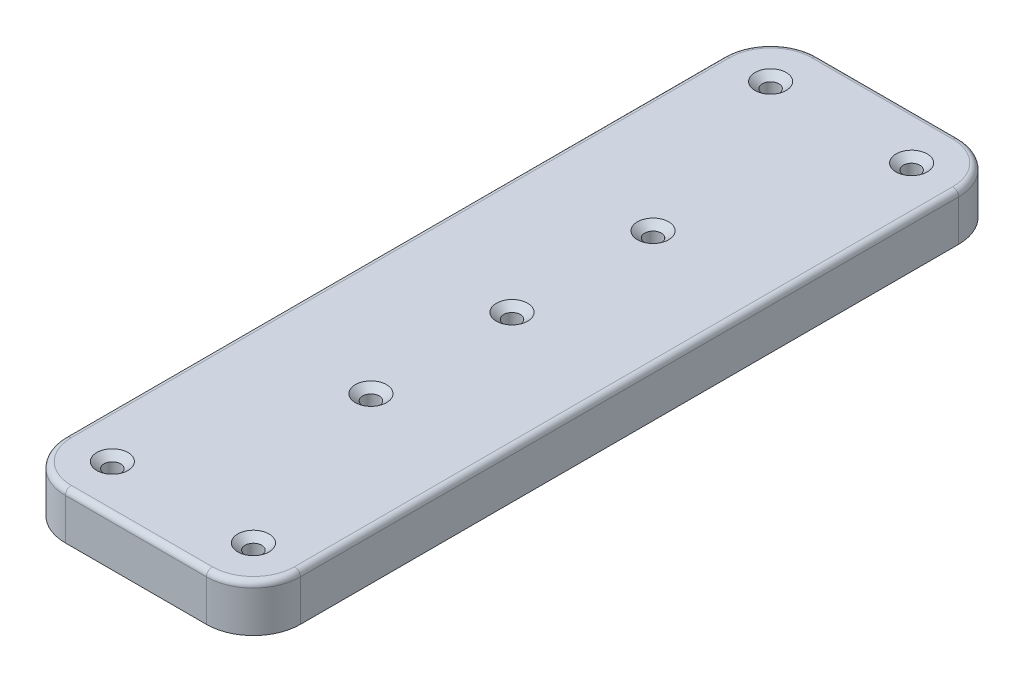
ISO-10303-21;
HEADER;
FILE_DESCRIPTION(('STEP AP214'),'2;1');
FILE_NAME('part.step','',(''),(''),'','','');
FILE_SCHEMA(('AUTOMOTIVE_DESIGN { 1 0 10303 214 1 1 1 1 }'));
ENDSEC;
DATA;
#1=APPLICATION_CONTEXT('core data for automotive mechanical design processes');
#2=APPLICATION_PROTOCOL_DEFINITION('international standard','automotive_design',2000,#1);
#3=PRODUCT_CONTEXT('',#1,'mechanical');
#4=PRODUCT('Part','Part','',(#3));
#5=PRODUCT_RELATED_PRODUCT_CATEGORY('part','',(#4));
#6=PRODUCT_DEFINITION_FORMATION('','',#4);
#7=PRODUCT_DEFINITION_CONTEXT('part definition',#1,'design');
#8=PRODUCT_DEFINITION('design','',#6,#7);
#9=PRODUCT_DEFINITION_SHAPE('','',#8);
#10=(LENGTH_UNIT() NAMED_UNIT(*) SI_UNIT(.MILLI.,.METRE.));
#11=(NAMED_UNIT(*) PLANE_ANGLE_UNIT() SI_UNIT($,.RADIAN.));
#12=(NAMED_UNIT(*) SI_UNIT($,.STERADIAN.) SOLID_ANGLE_UNIT());
#13=UNCERTAINTY_MEASURE_WITH_UNIT(LENGTH_MEASURE(1.E-05),#10,'distance_accuracy_value','');
#14=(GEOMETRIC_REPRESENTATION_CONTEXT(3) GLOBAL_UNCERTAINTY_ASSIGNED_CONTEXT((#13)) GLOBAL_UNIT_ASSIGNED_CONTEXT((#10,
#11,#12)) REPRESENTATION_CONTEXT('',''));
#15=CARTESIAN_POINT('',(0.,0.,0.));
#16=DIRECTION('',(0.,0.,1.));
#17=DIRECTION('',(1.,0.,0.));
#18=AXIS2_PLACEMENT_3D('',#15,#16,#17);
#19=CARTESIAN_POINT('',(-31.75,6.35,101.6));
#20=DIRECTION('',(0.,-1.,0.));
#21=DIRECTION('',(0.,0.,-1.));
#22=AXIS2_PLACEMENT_3D('',#19,#20,#21);
#23=PLANE('',#22);
#24=DIRECTION('',(0.,0.,-1.));
#25=VECTOR('',#24,1.);
#26=CARTESIAN_POINT('',(-30.1625,6.35,101.6));
#27=LINE('',#26,#25);
#28=CARTESIAN_POINT('',(-30.1625,6.35,-88.9));
#29=VERTEX_POINT('',#28);
#30=CARTESIAN_POINT('',(-30.1625,6.35,88.9));
#31=VERTEX_POINT('',#30);
#32=EDGE_CURVE('E169',#29,#31,#27,.F.);
#33=ORIENTED_EDGE('',*,*,#32,.T.);
#34=CARTESIAN_POINT('',(-19.05,6.35,88.9));
#35=DIRECTION('',(0.,-1.,0.));
#36=DIRECTION('',(0.,0.,-1.));
#37=AXIS2_PLACEMENT_3D('',#34,#35,#36);
#38=CIRCLE('',#37,11.1125);
#39=CARTESIAN_POINT('',(-19.05,6.35,100.0125));
#40=VERTEX_POINT('',#39);
#41=EDGE_CURVE('E183',#31,#40,#38,.F.);
#42=ORIENTED_EDGE('',*,*,#41,.T.);
#43=DIRECTION('',(-1.,0.,0.));
#44=VECTOR('',#43,1.);
#45=CARTESIAN_POINT('',(-31.75,6.35,100.0125));
#46=LINE('',#45,#44);
#47=CARTESIAN_POINT('',(19.05,6.35,100.0125));
#48=VERTEX_POINT('',#47);
#49=EDGE_CURVE('E181',#40,#48,#46,.F.);
#50=ORIENTED_EDGE('',*,*,#49,.T.);
#51=CARTESIAN_POINT('',(19.05,6.35,88.9));
#52=DIRECTION('',(0.,-1.,0.));
#53=DIRECTION('',(0.,0.,-1.));
#54=AXIS2_PLACEMENT_3D('',#51,#52,#53);
#55=CIRCLE('',#54,11.1125);
#56=CARTESIAN_POINT('',(30.1625,6.35,88.9));
#57=VERTEX_POINT('',#56);
#58=EDGE_CURVE('E179',#48,#57,#55,.F.);
#59=ORIENTED_EDGE('',*,*,#58,.T.);
#60=DIRECTION('',(0.,0.,-1.));
#61=VECTOR('',#60,1.);
#62=CARTESIAN_POINT('',(30.1625,6.35,101.6));
#63=LINE('',#62,#61);
#64=CARTESIAN_POINT('',(30.1625,6.35,-88.9));
#65=VERTEX_POINT('',#64);
#66=EDGE_CURVE('E177',#57,#65,#63,.T.);
#67=ORIENTED_EDGE('',*,*,#66,.T.);
#68=CARTESIAN_POINT('',(19.05,6.35,-88.9));
#69=DIRECTION('',(0.,-1.,0.));
#70=DIRECTION('',(0.,0.,-1.));
#71=AXIS2_PLACEMENT_3D('',#68,#69,#70);
#72=CIRCLE('',#71,11.1125);
#73=CARTESIAN_POINT('',(19.05,6.35,-100.0125));
#74=VERTEX_POINT('',#73);
#75=EDGE_CURVE('E175',#65,#74,#72,.F.);
#76=ORIENTED_EDGE('',*,*,#75,.T.);
#77=DIRECTION('',(-1.,0.,0.));
#78=VECTOR('',#77,1.);
#79=CARTESIAN_POINT('',(-19.05,6.35,-100.0125));
#80=LINE('',#79,#78);
#81=CARTESIAN_POINT('',(-19.05,6.35,-100.0125));
#82=VERTEX_POINT('',#81);
#83=EDGE_CURVE('E173',#74,#82,#80,.T.);
#84=ORIENTED_EDGE('',*,*,#83,.T.);
#85=CARTESIAN_POINT('',(-19.05,6.35,-88.9));
#86=DIRECTION('',(0.,-1.,0.));
#87=DIRECTION('',(0.,0.,-1.));
#88=AXIS2_PLACEMENT_3D('',#85,#86,#87);
#89=CIRCLE('',#88,11.1125);
#90=EDGE_CURVE('E171',#82,#29,#89,.F.);
#91=ORIENTED_EDGE('',*,*,#90,.T.);
#92=EDGE_LOOP('',(#33,#42,#50,#59,#67,#76,#84,#91));
#93=FACE_BOUND('',#92,.T.);
#94=CARTESIAN_POINT('',(-19.05,6.35,88.9));
#95=DIRECTION('',(0.,1.,0.));
#96=DIRECTION('',(0.,0.,1.));
#97=AXIS2_PLACEMENT_3D('',#94,#95,#96);
#98=CIRCLE('',#97,4.2164);
#99=CARTESIAN_POINT('',(-19.05,6.35,93.1164));
#100=VERTEX_POINT('',#99);
#101=EDGE_CURVE('E236',#100,#100,#98,.T.);
#102=ORIENTED_EDGE('',*,*,#101,.F.);
#103=EDGE_LOOP('',(#102));
#104=FACE_BOUND('',#103,.T.);
#105=CARTESIAN_POINT('',(-19.05,6.35,-88.9));
#106=DIRECTION('',(0.,1.,0.));
#107=DIRECTION('',(0.,0.,1.));
#108=AXIS2_PLACEMENT_3D('',#105,#106,#107);
#109=CIRCLE('',#108,4.2164);
#110=CARTESIAN_POINT('',(-19.05,6.35,-84.6836));
#111=VERTEX_POINT('',#110);
#112=EDGE_CURVE('E245',#111,#111,#109,.T.);
#113=ORIENTED_EDGE('',*,*,#112,.F.);
#114=EDGE_LOOP('',(#113));
#115=FACE_BOUND('',#114,.T.);
#116=CARTESIAN_POINT('',(19.05,6.35,-88.9));
#117=DIRECTION('',(0.,1.,0.));
#118=DIRECTION('',(0.,0.,1.));
#119=AXIS2_PLACEMENT_3D('',#116,#117,#118);
#120=CIRCLE('',#119,4.2164);
#121=CARTESIAN_POINT('',(19.05,6.35,-84.6836));
#122=VERTEX_POINT('',#121);
#123=EDGE_CURVE('E254',#122,#122,#120,.T.);
#124=ORIENTED_EDGE('',*,*,#123,.F.);
#125=EDGE_LOOP('',(#124));
#126=FACE_BOUND('',#125,.T.);
#127=CARTESIAN_POINT('',(0.,6.35,38.1));
#128=DIRECTION('',(0.,1.,0.));
#129=DIRECTION('',(0.,0.,1.));
#130=AXIS2_PLACEMENT_3D('',#127,#128,#129);
#131=CIRCLE('',#130,4.2164);
#132=CARTESIAN_POINT('',(0.,6.35,42.3164));
#133=VERTEX_POINT('',#132);
#134=EDGE_CURVE('E263',#133,#133,#131,.T.);
#135=ORIENTED_EDGE('',*,*,#134,.F.);
#136=EDGE_LOOP('',(#135));
#137=FACE_BOUND('',#136,.T.);
#138=CARTESIAN_POINT('',(0.,6.35,-38.1));
#139=DIRECTION('',(0.,1.,0.));
#140=DIRECTION('',(0.,0.,1.));
#141=AXIS2_PLACEMENT_3D('',#138,#139,#140);
#142=CIRCLE('',#141,4.2164);
#143=CARTESIAN_POINT('',(0.,6.35,-33.8836));
#144=VERTEX_POINT('',#143);
#145=EDGE_CURVE('E272',#144,#144,#142,.T.);
#146=ORIENTED_EDGE('',*,*,#145,.F.);
#147=EDGE_LOOP('',(#146));
#148=FACE_BOUND('',#147,.T.);
#149=CARTESIAN_POINT('',(0.,6.35,0.));
#150=DIRECTION('',(0.,1.,0.));
#151=DIRECTION('',(0.,0.,1.));
#152=AXIS2_PLACEMENT_3D('',#149,#150,#151);
#153=CIRCLE('',#152,4.2164);
#154=CARTESIAN_POINT('',(0.,6.35,4.2164));
#155=VERTEX_POINT('',#154);
#156=EDGE_CURVE('E281',#155,#155,#153,.T.);
#157=ORIENTED_EDGE('',*,*,#156,.F.);
#158=EDGE_LOOP('',(#157));
#159=FACE_BOUND('',#158,.T.);
#160=CARTESIAN_POINT('',(19.05,6.35,88.9));
#161=DIRECTION('',(0.,1.,0.));
#162=DIRECTION('',(0.,0.,1.));
#163=AXIS2_PLACEMENT_3D('',#160,#161,#162);
#164=CIRCLE('',#163,4.2164);
#165=CARTESIAN_POINT('',(19.05,6.35,93.1164));
#166=VERTEX_POINT('',#165);
#167=EDGE_CURVE('E220',#166,#166,#164,.T.);
#168=ORIENTED_EDGE('',*,*,#167,.F.);
#169=EDGE_LOOP('',(#168));
#170=FACE_BOUND('',#169,.T.);
#171=ADVANCED_FACE('F34',(#93,#104,#115,#126,#137,#148,#159,#170),#23,.F.);
#172=CARTESIAN_POINT('',(31.75,-6.35,101.6));
#173=DIRECTION('',(-1.,0.,0.));
#174=DIRECTION('',(0.,0.,1.));
#175=AXIS2_PLACEMENT_3D('',#172,#173,#174);
#176=PLANE('',#175);
#177=DIRECTION('',(0.,1.,0.));
#178=VECTOR('',#177,1.);
#179=CARTESIAN_POINT('',(31.75,6.35,-88.9));
#180=LINE('',#179,#178);
#181=CARTESIAN_POINT('',(31.75,-6.35,-88.9));
#182=VERTEX_POINT('',#181);
#183=CARTESIAN_POINT('',(31.75,4.7625,-88.9));
#184=VERTEX_POINT('',#183);
#185=EDGE_CURVE('E161',#182,#184,#180,.T.);
#186=ORIENTED_EDGE('',*,*,#185,.T.);
#187=DIRECTION('',(0.,0.,-1.));
#188=VECTOR('',#187,1.);
#189=CARTESIAN_POINT('',(31.75,4.7625,101.6));
#190=LINE('',#189,#188);
#191=CARTESIAN_POINT('',(31.75,4.7625,88.9));
#192=VERTEX_POINT('',#191);
#193=EDGE_CURVE('E191',#184,#192,#190,.F.);
#194=ORIENTED_EDGE('',*,*,#193,.T.);
#195=DIRECTION('',(0.,1.,0.));
#196=VECTOR('',#195,1.);
#197=CARTESIAN_POINT('',(31.75,-6.35,88.9));
#198=LINE('',#197,#196);
#199=CARTESIAN_POINT('',(31.75,-6.35,88.9));
#200=VERTEX_POINT('',#199);
#201=EDGE_CURVE('E159',#192,#200,#198,.F.);
#202=ORIENTED_EDGE('',*,*,#201,.T.);
#203=DIRECTION('',(0.,0.,-1.));
#204=VECTOR('',#203,1.);
#205=CARTESIAN_POINT('',(31.75,-6.35,101.6));
#206=LINE('',#205,#204);
#207=EDGE_CURVE('E141',#200,#182,#206,.T.);
#208=ORIENTED_EDGE('',*,*,#207,.T.);
#209=EDGE_LOOP('',(#186,#194,#202,#208));
#210=FACE_BOUND('',#209,.T.);
#211=ADVANCED_FACE('F297',(#210),#176,.F.);
#212=CARTESIAN_POINT('',(-31.75,-6.35,101.6));
#213=DIRECTION('',(1.,0.,0.));
#214=DIRECTION('',(0.,0.,-1.));
#215=AXIS2_PLACEMENT_3D('',#212,#213,#214);
#216=PLANE('',#215);
#217=DIRECTION('',(0.,-1.,0.));
#218=VECTOR('',#217,1.);
#219=CARTESIAN_POINT('',(-31.75,-6.35,88.9));
#220=LINE('',#219,#218);
#221=CARTESIAN_POINT('',(-31.75,-6.35,88.9));
#222=VERTEX_POINT('',#221);
#223=CARTESIAN_POINT('',(-31.75,4.7625,88.9));
#224=VERTEX_POINT('',#223);
#225=EDGE_CURVE('E138',#222,#224,#220,.F.);
#226=ORIENTED_EDGE('',*,*,#225,.T.);
#227=DIRECTION('',(0.,0.,-1.));
#228=VECTOR('',#227,1.);
#229=CARTESIAN_POINT('',(-31.75,4.7625,101.6));
#230=LINE('',#229,#228);
#231=CARTESIAN_POINT('',(-31.75,4.7625,-88.9));
#232=VERTEX_POINT('',#231);
#233=EDGE_CURVE('E11',#224,#232,#230,.T.);
#234=ORIENTED_EDGE('',*,*,#233,.T.);
#235=DIRECTION('',(0.,-1.,0.));
#236=VECTOR('',#235,1.);
#237=CARTESIAN_POINT('',(-31.75,-6.35,-88.9));
#238=LINE('',#237,#236);
#239=CARTESIAN_POINT('',(-31.75,-6.35,-88.9));
#240=VERTEX_POINT('',#239);
#241=EDGE_CURVE('E139',#232,#240,#238,.T.);
#242=ORIENTED_EDGE('',*,*,#241,.T.);
#243=DIRECTION('',(0.,0.,-1.));
#244=VECTOR('',#243,1.);
#245=CARTESIAN_POINT('',(-31.75,-6.35,101.6));
#246=LINE('',#245,#244);
#247=EDGE_CURVE('E128',#222,#240,#246,.T.);
#248=ORIENTED_EDGE('',*,*,#247,.F.);
#249=EDGE_LOOP('',(#226,#234,#242,#248));
#250=FACE_BOUND('',#249,.T.);
#251=ADVANCED_FACE('F137',(#250),#216,.F.);
#252=CARTESIAN_POINT('',(-31.75,-6.35,101.6));
#253=DIRECTION('',(0.,1.,0.));
#254=DIRECTION('',(0.,0.,1.));
#255=AXIS2_PLACEMENT_3D('',#252,#253,#254);
#256=PLANE('',#255);
#257=CARTESIAN_POINT('',(19.05,-6.35,88.9));
#258=DIRECTION('',(0.,1.,0.));
#259=DIRECTION('',(0.,0.,1.));
#260=AXIS2_PLACEMENT_3D('',#257,#258,#259);
#261=CIRCLE('',#260,2.2479);
#262=CARTESIAN_POINT('',(19.05,-6.35,91.1479));
#263=VERTEX_POINT('',#262);
#264=EDGE_CURVE('E231',#263,#263,#261,.T.);
#265=ORIENTED_EDGE('',*,*,#264,.T.);
#266=EDGE_LOOP('',(#265));
#267=FACE_BOUND('',#266,.T.);
#268=CARTESIAN_POINT('',(-19.05,-6.35,88.9));
#269=DIRECTION('',(0.,1.,0.));
#270=DIRECTION('',(0.,0.,1.));
#271=AXIS2_PLACEMENT_3D('',#268,#269,#270);
#272=CIRCLE('',#271,2.2479);
#273=CARTESIAN_POINT('',(-19.05,-6.35,91.1479));
#274=VERTEX_POINT('',#273);
#275=EDGE_CURVE('E242',#274,#274,#272,.T.);
#276=ORIENTED_EDGE('',*,*,#275,.T.);
#277=EDGE_LOOP('',(#276));
#278=FACE_BOUND('',#277,.T.);
#279=CARTESIAN_POINT('',(-19.05,-6.35,-88.9));
#280=DIRECTION('',(0.,1.,0.));
#281=DIRECTION('',(0.,0.,1.));
#282=AXIS2_PLACEMENT_3D('',#279,#280,#281);
#283=CIRCLE('',#282,2.2479);
#284=CARTESIAN_POINT('',(-19.05,-6.35,-86.6521));
#285=VERTEX_POINT('',#284);
#286=EDGE_CURVE('E251',#285,#285,#283,.T.);
#287=ORIENTED_EDGE('',*,*,#286,.T.);
#288=EDGE_LOOP('',(#287));
#289=FACE_BOUND('',#288,.T.);
#290=CARTESIAN_POINT('',(19.05,-6.35,-88.9));
#291=DIRECTION('',(0.,1.,0.));
#292=DIRECTION('',(0.,0.,1.));
#293=AXIS2_PLACEMENT_3D('',#290,#291,#292);
#294=CIRCLE('',#293,2.2479);
#295=CARTESIAN_POINT('',(19.05,-6.35,-86.6521));
#296=VERTEX_POINT('',#295);
#297=EDGE_CURVE('E260',#296,#296,#294,.T.);
#298=ORIENTED_EDGE('',*,*,#297,.T.);
#299=EDGE_LOOP('',(#298));
#300=FACE_BOUND('',#299,.T.);
#301=CARTESIAN_POINT('',(0.,-6.35,38.1));
#302=DIRECTION('',(0.,1.,0.));
#303=DIRECTION('',(0.,0.,1.));
#304=AXIS2_PLACEMENT_3D('',#301,#302,#303);
#305=CIRCLE('',#304,2.2479);
#306=CARTESIAN_POINT('',(0.,-6.35,40.3479));
#307=VERTEX_POINT('',#306);
#308=EDGE_CURVE('E269',#307,#307,#305,.T.);
#309=ORIENTED_EDGE('',*,*,#308,.T.);
#310=EDGE_LOOP('',(#309));
#311=FACE_BOUND('',#310,.T.);
#312=CARTESIAN_POINT('',(0.,-6.35,-38.1));
#313=DIRECTION('',(0.,1.,0.));
#314=DIRECTION('',(0.,0.,1.));
#315=AXIS2_PLACEMENT_3D('',#312,#313,#314);
#316=CIRCLE('',#315,2.2479);
#317=CARTESIAN_POINT('',(0.,-6.35,-35.8521));
#318=VERTEX_POINT('',#317);
#319=EDGE_CURVE('E278',#318,#318,#316,.T.);
#320=ORIENTED_EDGE('',*,*,#319,.T.);
#321=EDGE_LOOP('',(#320));
#322=FACE_BOUND('',#321,.T.);
#323=CARTESIAN_POINT('',(0.,-6.35,0.));
#324=DIRECTION('',(0.,1.,0.));
#325=DIRECTION('',(0.,0.,1.));
#326=AXIS2_PLACEMENT_3D('',#323,#324,#325);
#327=CIRCLE('',#326,2.2479);
#328=CARTESIAN_POINT('',(0.,-6.35,2.2479));
#329=VERTEX_POINT('',#328);
#330=EDGE_CURVE('E287',#329,#329,#327,.T.);
#331=ORIENTED_EDGE('',*,*,#330,.T.);
#332=EDGE_LOOP('',(#331));
#333=FACE_BOUND('',#332,.T.);
#334=ORIENTED_EDGE('',*,*,#247,.T.);
#335=CARTESIAN_POINT('',(-19.05,-6.35,-88.9));
#336=DIRECTION('',(0.,1.,0.));
#337=DIRECTION('',(0.,0.,1.));
#338=AXIS2_PLACEMENT_3D('',#335,#336,#337);
#339=CIRCLE('',#338,12.7);
#340=CARTESIAN_POINT('',(-19.05,-6.35,-101.6));
#341=VERTEX_POINT('',#340);
#342=EDGE_CURVE('E153',#240,#341,#339,.F.);
#343=ORIENTED_EDGE('',*,*,#342,.T.);
#344=DIRECTION('',(1.,0.,0.));
#345=VECTOR('',#344,1.);
#346=CARTESIAN_POINT('',(-31.75,-6.35,-101.6));
#347=LINE('',#346,#345);
#348=CARTESIAN_POINT('',(19.05,-6.35,-101.6));
#349=VERTEX_POINT('',#348);
#350=EDGE_CURVE('E290',#341,#349,#347,.T.);
#351=ORIENTED_EDGE('',*,*,#350,.T.);
#352=CARTESIAN_POINT('',(19.05,-6.35,-88.9));
#353=DIRECTION('',(0.,1.,0.));
#354=DIRECTION('',(0.,0.,1.));
#355=AXIS2_PLACEMENT_3D('',#352,#353,#354);
#356=CIRCLE('',#355,12.7);
#357=EDGE_CURVE('E134',#349,#182,#356,.F.);
#358=ORIENTED_EDGE('',*,*,#357,.T.);
#359=ORIENTED_EDGE('',*,*,#207,.F.);
#360=CARTESIAN_POINT('',(19.05,-6.35,88.9));
#361=DIRECTION('',(0.,1.,0.));
#362=DIRECTION('',(0.,0.,1.));
#363=AXIS2_PLACEMENT_3D('',#360,#361,#362);
#364=CIRCLE('',#363,12.7);
#365=CARTESIAN_POINT('',(19.05,-6.35,101.6));
#366=VERTEX_POINT('',#365);
#367=EDGE_CURVE('E135',#200,#366,#364,.F.);
#368=ORIENTED_EDGE('',*,*,#367,.T.);
#369=DIRECTION('',(1.,0.,0.));
#370=VECTOR('',#369,1.);
#371=CARTESIAN_POINT('',(-31.75,-6.35,101.6));
#372=LINE('',#371,#370);
#373=CARTESIAN_POINT('',(-19.05,-6.35,101.6));
#374=VERTEX_POINT('',#373);
#375=EDGE_CURVE('E130',#374,#366,#372,.T.);
#376=ORIENTED_EDGE('',*,*,#375,.F.);
#377=CARTESIAN_POINT('',(-19.05,-6.35,88.9));
#378=DIRECTION('',(0.,1.,0.));
#379=DIRECTION('',(0.,0.,1.));
#380=AXIS2_PLACEMENT_3D('',#377,#378,#379);
#381=CIRCLE('',#380,12.7);
#382=EDGE_CURVE('E125',#374,#222,#381,.F.);
#383=ORIENTED_EDGE('',*,*,#382,.T.);
#384=EDGE_LOOP('',(#334,#343,#351,#358,#359,#368,#376,#383));
#385=FACE_BOUND('',#384,.T.);
#386=ADVANCED_FACE('F127',(#267,#278,#289,#300,#311,#322,#333,#385),#256,.F.);
#387=CARTESIAN_POINT('',(0.,0.,101.6));
#388=DIRECTION('',(0.,0.,-1.));
#389=DIRECTION('',(-1.,0.,0.));
#390=AXIS2_PLACEMENT_3D('',#387,#388,#389);
#391=PLANE('',#390);
#392=DIRECTION('',(0.,1.,0.));
#393=VECTOR('',#392,1.);
#394=CARTESIAN_POINT('',(19.05,0.,101.6));
#395=LINE('',#394,#393);
#396=CARTESIAN_POINT('',(19.05,4.7625,101.6));
#397=VERTEX_POINT('',#396);
#398=EDGE_CURVE('E164',#366,#397,#395,.T.);
#399=ORIENTED_EDGE('',*,*,#398,.T.);
#400=DIRECTION('',(-1.,0.,0.));
#401=VECTOR('',#400,1.);
#402=CARTESIAN_POINT('',(0.,4.7625,101.6));
#403=LINE('',#402,#401);
#404=CARTESIAN_POINT('',(-19.05,4.7625,101.6));
#405=VERTEX_POINT('',#404);
#406=EDGE_CURVE('E187',#397,#405,#403,.T.);
#407=ORIENTED_EDGE('',*,*,#406,.T.);
#408=DIRECTION('',(0.,-1.,0.));
#409=VECTOR('',#408,1.);
#410=CARTESIAN_POINT('',(-19.05,0.,101.6));
#411=LINE('',#410,#409);
#412=EDGE_CURVE('E167',#405,#374,#411,.T.);
#413=ORIENTED_EDGE('',*,*,#412,.T.);
#414=ORIENTED_EDGE('',*,*,#375,.T.);
#415=EDGE_LOOP('',(#399,#407,#413,#414));
#416=FACE_BOUND('',#415,.T.);
#417=ADVANCED_FACE('F314',(#416),#391,.F.);
#418=CARTESIAN_POINT('',(0.,0.,-101.6));
#419=DIRECTION('',(0.,0.,-1.));
#420=DIRECTION('',(-1.,0.,0.));
#421=AXIS2_PLACEMENT_3D('',#418,#419,#420);
#422=PLANE('',#421);
#423=DIRECTION('',(0.,-1.,0.));
#424=VECTOR('',#423,1.);
#425=CARTESIAN_POINT('',(-19.05,6.35,-101.6));
#426=LINE('',#425,#424);
#427=CARTESIAN_POINT('',(-19.05,4.7625,-101.6));
#428=VERTEX_POINT('',#427);
#429=EDGE_CURVE('E157',#341,#428,#426,.F.);
#430=ORIENTED_EDGE('',*,*,#429,.T.);
#431=DIRECTION('',(-1.,0.,0.));
#432=VECTOR('',#431,1.);
#433=CARTESIAN_POINT('',(19.05,4.7625,-101.6));
#434=LINE('',#433,#432);
#435=CARTESIAN_POINT('',(19.05,4.7625,-101.6));
#436=VERTEX_POINT('',#435);
#437=EDGE_CURVE('E195',#428,#436,#434,.F.);
#438=ORIENTED_EDGE('',*,*,#437,.T.);
#439=DIRECTION('',(0.,1.,0.));
#440=VECTOR('',#439,1.);
#441=CARTESIAN_POINT('',(19.05,-6.35,-101.6));
#442=LINE('',#441,#440);
#443=EDGE_CURVE('E155',#436,#349,#442,.F.);
#444=ORIENTED_EDGE('',*,*,#443,.T.);
#445=ORIENTED_EDGE('',*,*,#350,.F.);
#446=EDGE_LOOP('',(#430,#438,#444,#445));
#447=FACE_BOUND('',#446,.T.);
#448=ADVANCED_FACE('F338',(#447),#422,.T.);
#449=CARTESIAN_POINT('',(-19.05,-6.35,-88.9));
#450=DIRECTION('',(0.,1.,0.));
#451=DIRECTION('',(0.,0.,1.));
#452=AXIS2_PLACEMENT_3D('',#449,#450,#451);
#453=CYLINDRICAL_SURFACE('',#452,12.7);
#454=ORIENTED_EDGE('',*,*,#241,.F.);
#455=CARTESIAN_POINT('',(-19.05,4.7625,-88.9));
#456=DIRECTION('',(0.,-1.,0.));
#457=DIRECTION('',(0.,0.,-1.));
#458=AXIS2_PLACEMENT_3D('',#455,#456,#457);
#459=CIRCLE('',#458,12.7);
#460=EDGE_CURVE('E43',#232,#428,#459,.T.);
#461=ORIENTED_EDGE('',*,*,#460,.T.);
#462=ORIENTED_EDGE('',*,*,#429,.F.);
#463=ORIENTED_EDGE('',*,*,#342,.F.);
#464=EDGE_LOOP('',(#454,#461,#462,#463));
#465=FACE_BOUND('',#464,.T.);
#466=ADVANCED_FACE('F340',(#465),#453,.T.);
#467=CARTESIAN_POINT('',(19.05,-6.35,-88.9));
#468=DIRECTION('',(0.,-1.,0.));
#469=DIRECTION('',(0.,0.,-1.));
#470=AXIS2_PLACEMENT_3D('',#467,#468,#469);
#471=CYLINDRICAL_SURFACE('',#470,12.7);
#472=ORIENTED_EDGE('',*,*,#443,.F.);
#473=CARTESIAN_POINT('',(19.05,4.7625,-88.9));
#474=DIRECTION('',(0.,-1.,0.));
#475=DIRECTION('',(0.,0.,-1.));
#476=AXIS2_PLACEMENT_3D('',#473,#474,#475);
#477=CIRCLE('',#476,12.7);
#478=EDGE_CURVE('E193',#436,#184,#477,.T.);
#479=ORIENTED_EDGE('',*,*,#478,.T.);
#480=ORIENTED_EDGE('',*,*,#185,.F.);
#481=ORIENTED_EDGE('',*,*,#357,.F.);
#482=EDGE_LOOP('',(#472,#479,#480,#481));
#483=FACE_BOUND('',#482,.T.);
#484=ADVANCED_FACE('F303',(#483),#471,.T.);
#485=CARTESIAN_POINT('',(-19.05,0.,88.9));
#486=DIRECTION('',(0.,-1.,0.));
#487=DIRECTION('',(0.,0.,-1.));
#488=AXIS2_PLACEMENT_3D('',#485,#486,#487);
#489=CYLINDRICAL_SURFACE('',#488,12.7);
#490=ORIENTED_EDGE('',*,*,#412,.F.);
#491=CARTESIAN_POINT('',(-19.05,4.7625,88.9));
#492=DIRECTION('',(0.,-1.,0.));
#493=DIRECTION('',(0.,0.,-1.));
#494=AXIS2_PLACEMENT_3D('',#491,#492,#493);
#495=CIRCLE('',#494,12.7);
#496=EDGE_CURVE('E146',#405,#224,#495,.T.);
#497=ORIENTED_EDGE('',*,*,#496,.T.);
#498=ORIENTED_EDGE('',*,*,#225,.F.);
#499=ORIENTED_EDGE('',*,*,#382,.F.);
#500=EDGE_LOOP('',(#490,#497,#498,#499));
#501=FACE_BOUND('',#500,.T.);
#502=ADVANCED_FACE('F144',(#501),#489,.T.);
#503=CARTESIAN_POINT('',(19.05,0.,88.9));
#504=DIRECTION('',(0.,1.,0.));
#505=DIRECTION('',(0.,0.,1.));
#506=AXIS2_PLACEMENT_3D('',#503,#504,#505);
#507=CYLINDRICAL_SURFACE('',#506,12.7);
#508=ORIENTED_EDGE('',*,*,#201,.F.);
#509=CARTESIAN_POINT('',(19.05,4.7625,88.9));
#510=DIRECTION('',(0.,-1.,0.));
#511=DIRECTION('',(0.,0.,-1.));
#512=AXIS2_PLACEMENT_3D('',#509,#510,#511);
#513=CIRCLE('',#512,12.7);
#514=EDGE_CURVE('E189',#192,#397,#513,.T.);
#515=ORIENTED_EDGE('',*,*,#514,.T.);
#516=ORIENTED_EDGE('',*,*,#398,.F.);
#517=ORIENTED_EDGE('',*,*,#367,.F.);
#518=EDGE_LOOP('',(#508,#515,#516,#517));
#519=FACE_BOUND('',#518,.T.);
#520=ADVANCED_FACE('F311',(#519),#507,.T.);
#521=CARTESIAN_POINT('',(0.,6.35,0.));
#522=DIRECTION('',(0.,1.,0.));
#523=DIRECTION('',(0.,0.,1.));
#524=AXIS2_PLACEMENT_3D('',#521,#522,#523);
#525=CYLINDRICAL_SURFACE('',#524,2.2479);
#526=ORIENTED_EDGE('',*,*,#330,.F.);
#527=EDGE_LOOP('',(#526));
#528=FACE_BOUND('',#527,.T.);
#529=CARTESIAN_POINT('',(0.,4.69823237602752,0.));
#530=DIRECTION('',(0.,1.,0.));
#531=DIRECTION('',(0.,0.,1.));
#532=AXIS2_PLACEMENT_3D('',#529,#530,#531);
#533=CIRCLE('',#532,2.2479);
#534=CARTESIAN_POINT('',(0.,4.69823237602752,2.2479));
#535=VERTEX_POINT('',#534);
#536=EDGE_CURVE('E284',#535,#535,#533,.T.);
#537=ORIENTED_EDGE('',*,*,#536,.T.);
#538=EDGE_LOOP('',(#537));
#539=FACE_BOUND('',#538,.T.);
#540=ADVANCED_FACE('F364',(#528,#539),#525,.F.);
#541=CARTESIAN_POINT('',(0.,6.35,0.));
#542=DIRECTION('',(0.,1.,0.));
#543=DIRECTION('',(0.,0.,1.));
#544=AXIS2_PLACEMENT_3D('',#541,#542,#543);
#545=CONICAL_SURFACE('',#544,4.2164,0.872664625997164);
#546=ORIENTED_EDGE('',*,*,#536,.F.);
#547=EDGE_LOOP('',(#546));
#548=FACE_BOUND('',#547,.T.);
#549=ORIENTED_EDGE('',*,*,#156,.T.);
#550=EDGE_LOOP('',(#549));
#551=FACE_BOUND('',#550,.T.);
#552=ADVANCED_FACE('F367',(#548,#551),#545,.F.);
#553=CARTESIAN_POINT('',(0.,6.35,-38.1));
#554=DIRECTION('',(0.,1.,0.));
#555=DIRECTION('',(0.,0.,1.));
#556=AXIS2_PLACEMENT_3D('',#553,#554,#555);
#557=CYLINDRICAL_SURFACE('',#556,2.2479);
#558=ORIENTED_EDGE('',*,*,#319,.F.);
#559=EDGE_LOOP('',(#558));
#560=FACE_BOUND('',#559,.T.);
#561=CARTESIAN_POINT('',(0.,4.69823237602752,-38.1));
#562=DIRECTION('',(0.,1.,0.));
#563=DIRECTION('',(0.,0.,1.));
#564=AXIS2_PLACEMENT_3D('',#561,#562,#563);
#565=CIRCLE('',#564,2.2479);
#566=CARTESIAN_POINT('',(0.,4.69823237602752,-35.8521));
#567=VERTEX_POINT('',#566);
#568=EDGE_CURVE('E275',#567,#567,#565,.T.);
#569=ORIENTED_EDGE('',*,*,#568,.T.);
#570=EDGE_LOOP('',(#569));
#571=FACE_BOUND('',#570,.T.);
#572=ADVANCED_FACE('F371',(#560,#571),#557,.F.);
#573=CARTESIAN_POINT('',(0.,6.35,-38.1));
#574=DIRECTION('',(0.,1.,0.));
#575=DIRECTION('',(0.,0.,1.));
#576=AXIS2_PLACEMENT_3D('',#573,#574,#575);
#577=CONICAL_SURFACE('',#576,4.2164,0.872664625997164);
#578=ORIENTED_EDGE('',*,*,#568,.F.);
#579=EDGE_LOOP('',(#578));
#580=FACE_BOUND('',#579,.T.);
#581=ORIENTED_EDGE('',*,*,#145,.T.);
#582=EDGE_LOOP('',(#581));
#583=FACE_BOUND('',#582,.T.);
#584=ADVANCED_FACE('F375',(#580,#583),#577,.F.);
#585=CARTESIAN_POINT('',(0.,6.35,38.1));
#586=DIRECTION('',(0.,1.,0.));
#587=DIRECTION('',(0.,0.,1.));
#588=AXIS2_PLACEMENT_3D('',#585,#586,#587);
#589=CYLINDRICAL_SURFACE('',#588,2.2479);
#590=ORIENTED_EDGE('',*,*,#308,.F.);
#591=EDGE_LOOP('',(#590));
#592=FACE_BOUND('',#591,.T.);
#593=CARTESIAN_POINT('',(0.,4.69823237602752,38.1));
#594=DIRECTION('',(0.,1.,0.));
#595=DIRECTION('',(0.,0.,1.));
#596=AXIS2_PLACEMENT_3D('',#593,#594,#595);
#597=CIRCLE('',#596,2.2479);
#598=CARTESIAN_POINT('',(0.,4.69823237602752,40.3479));
#599=VERTEX_POINT('',#598);
#600=EDGE_CURVE('E266',#599,#599,#597,.T.);
#601=ORIENTED_EDGE('',*,*,#600,.T.);
#602=EDGE_LOOP('',(#601));
#603=FACE_BOUND('',#602,.T.);
#604=ADVANCED_FACE('F379',(#592,#603),#589,.F.);
#605=CARTESIAN_POINT('',(0.,6.35,38.1));
#606=DIRECTION('',(0.,1.,0.));
#607=DIRECTION('',(0.,0.,1.));
#608=AXIS2_PLACEMENT_3D('',#605,#606,#607);
#609=CONICAL_SURFACE('',#608,4.2164,0.872664625997164);
#610=ORIENTED_EDGE('',*,*,#600,.F.);
#611=EDGE_LOOP('',(#610));
#612=FACE_BOUND('',#611,.T.);
#613=ORIENTED_EDGE('',*,*,#134,.T.);
#614=EDGE_LOOP('',(#613));
#615=FACE_BOUND('',#614,.T.);
#616=ADVANCED_FACE('F383',(#612,#615),#609,.F.);
#617=CARTESIAN_POINT('',(19.05,6.35,-88.9));
#618=DIRECTION('',(0.,1.,0.));
#619=DIRECTION('',(0.,0.,1.));
#620=AXIS2_PLACEMENT_3D('',#617,#618,#619);
#621=CYLINDRICAL_SURFACE('',#620,2.2479);
#622=ORIENTED_EDGE('',*,*,#297,.F.);
#623=EDGE_LOOP('',(#622));
#624=FACE_BOUND('',#623,.T.);
#625=CARTESIAN_POINT('',(19.05,4.69823237602752,-88.9));
#626=DIRECTION('',(0.,1.,0.));
#627=DIRECTION('',(0.,0.,1.));
#628=AXIS2_PLACEMENT_3D('',#625,#626,#627);
#629=CIRCLE('',#628,2.2479);
#630=CARTESIAN_POINT('',(19.05,4.69823237602752,-86.6521));
#631=VERTEX_POINT('',#630);
#632=EDGE_CURVE('E257',#631,#631,#629,.T.);
#633=ORIENTED_EDGE('',*,*,#632,.T.);
#634=EDGE_LOOP('',(#633));
#635=FACE_BOUND('',#634,.T.);
#636=ADVANCED_FACE('F387',(#624,#635),#621,.F.);
#637=CARTESIAN_POINT('',(19.05,6.35,-88.9));
#638=DIRECTION('',(0.,1.,0.));
#639=DIRECTION('',(0.,0.,1.));
#640=AXIS2_PLACEMENT_3D('',#637,#638,#639);
#641=CONICAL_SURFACE('',#640,4.2164,0.872664625997163);
#642=ORIENTED_EDGE('',*,*,#632,.F.);
#643=EDGE_LOOP('',(#642));
#644=FACE_BOUND('',#643,.T.);
#645=ORIENTED_EDGE('',*,*,#123,.T.);
#646=EDGE_LOOP('',(#645));
#647=FACE_BOUND('',#646,.T.);
#648=ADVANCED_FACE('F391',(#644,#647),#641,.F.);
#649=CARTESIAN_POINT('',(-19.05,6.35,-88.9));
#650=DIRECTION('',(0.,1.,0.));
#651=DIRECTION('',(0.,0.,1.));
#652=AXIS2_PLACEMENT_3D('',#649,#650,#651);
#653=CYLINDRICAL_SURFACE('',#652,2.2479);
#654=ORIENTED_EDGE('',*,*,#286,.F.);
#655=EDGE_LOOP('',(#654));
#656=FACE_BOUND('',#655,.T.);
#657=CARTESIAN_POINT('',(-19.05,4.69823237602752,-88.9));
#658=DIRECTION('',(0.,1.,0.));
#659=DIRECTION('',(0.,0.,1.));
#660=AXIS2_PLACEMENT_3D('',#657,#658,#659);
#661=CIRCLE('',#660,2.2479);
#662=CARTESIAN_POINT('',(-19.05,4.69823237602752,-86.6521));
#663=VERTEX_POINT('',#662);
#664=EDGE_CURVE('E248',#663,#663,#661,.T.);
#665=ORIENTED_EDGE('',*,*,#664,.T.);
#666=EDGE_LOOP('',(#665));
#667=FACE_BOUND('',#666,.T.);
#668=ADVANCED_FACE('F395',(#656,#667),#653,.F.);
#669=CARTESIAN_POINT('',(-19.05,6.35,-88.9));
#670=DIRECTION('',(0.,1.,0.));
#671=DIRECTION('',(0.,0.,1.));
#672=AXIS2_PLACEMENT_3D('',#669,#670,#671);
#673=CONICAL_SURFACE('',#672,4.2164,0.872664625997164);
#674=ORIENTED_EDGE('',*,*,#664,.F.);
#675=EDGE_LOOP('',(#674));
#676=FACE_BOUND('',#675,.T.);
#677=ORIENTED_EDGE('',*,*,#112,.T.);
#678=EDGE_LOOP('',(#677));
#679=FACE_BOUND('',#678,.T.);
#680=ADVANCED_FACE('F399',(#676,#679),#673,.F.);
#681=CARTESIAN_POINT('',(-19.05,6.35,88.9));
#682=DIRECTION('',(0.,1.,0.));
#683=DIRECTION('',(0.,0.,1.));
#684=AXIS2_PLACEMENT_3D('',#681,#682,#683);
#685=CYLINDRICAL_SURFACE('',#684,2.2479);
#686=ORIENTED_EDGE('',*,*,#275,.F.);
#687=EDGE_LOOP('',(#686));
#688=FACE_BOUND('',#687,.T.);
#689=CARTESIAN_POINT('',(-19.05,4.69823237602752,88.9));
#690=DIRECTION('',(0.,1.,0.));
#691=DIRECTION('',(0.,0.,1.));
#692=AXIS2_PLACEMENT_3D('',#689,#690,#691);
#693=CIRCLE('',#692,2.2479);
#694=CARTESIAN_POINT('',(-19.05,4.69823237602752,91.1479));
#695=VERTEX_POINT('',#694);
#696=EDGE_CURVE('E239',#695,#695,#693,.T.);
#697=ORIENTED_EDGE('',*,*,#696,.T.);
#698=EDGE_LOOP('',(#697));
#699=FACE_BOUND('',#698,.T.);
#700=ADVANCED_FACE('F403',(#688,#699),#685,.F.);
#701=CARTESIAN_POINT('',(-19.05,6.35,88.9));
#702=DIRECTION('',(0.,1.,0.));
#703=DIRECTION('',(0.,0.,1.));
#704=AXIS2_PLACEMENT_3D('',#701,#702,#703);
#705=CONICAL_SURFACE('',#704,4.2164,0.872664625997164);
#706=ORIENTED_EDGE('',*,*,#696,.F.);
#707=EDGE_LOOP('',(#706));
#708=FACE_BOUND('',#707,.T.);
#709=ORIENTED_EDGE('',*,*,#101,.T.);
#710=EDGE_LOOP('',(#709));
#711=FACE_BOUND('',#710,.T.);
#712=ADVANCED_FACE('F407',(#708,#711),#705,.F.);
#713=CARTESIAN_POINT('',(19.05,6.35,88.9));
#714=DIRECTION('',(0.,1.,0.));
#715=DIRECTION('',(0.,0.,1.));
#716=AXIS2_PLACEMENT_3D('',#713,#714,#715);
#717=CYLINDRICAL_SURFACE('',#716,2.2479);
#718=ORIENTED_EDGE('',*,*,#264,.F.);
#719=EDGE_LOOP('',(#718));
#720=FACE_BOUND('',#719,.T.);
#721=CARTESIAN_POINT('',(19.05,4.69823237602752,88.9));
#722=DIRECTION('',(0.,1.,0.));
#723=DIRECTION('',(0.,0.,1.));
#724=AXIS2_PLACEMENT_3D('',#721,#722,#723);
#725=CIRCLE('',#724,2.2479);
#726=CARTESIAN_POINT('',(19.05,4.69823237602752,91.1479));
#727=VERTEX_POINT('',#726);
#728=EDGE_CURVE('E226',#727,#727,#725,.T.);
#729=ORIENTED_EDGE('',*,*,#728,.T.);
#730=EDGE_LOOP('',(#729));
#731=FACE_BOUND('',#730,.T.);
#732=ADVANCED_FACE('F411',(#720,#731),#717,.F.);
#733=CARTESIAN_POINT('',(19.05,6.35,88.9));
#734=DIRECTION('',(0.,1.,0.));
#735=DIRECTION('',(0.,0.,1.));
#736=AXIS2_PLACEMENT_3D('',#733,#734,#735);
#737=CONICAL_SURFACE('',#736,4.2164,0.872664625997163);
#738=ORIENTED_EDGE('',*,*,#728,.F.);
#739=EDGE_LOOP('',(#738));
#740=FACE_BOUND('',#739,.T.);
#741=ORIENTED_EDGE('',*,*,#167,.T.);
#742=EDGE_LOOP('',(#741));
#743=FACE_BOUND('',#742,.T.);
#744=ADVANCED_FACE('F415',(#740,#743),#737,.F.);
#745=CARTESIAN_POINT('',(19.05,4.7625,-88.9));
#746=DIRECTION('',(0.,-1.,0.));
#747=DIRECTION('',(0.,0.,-1.));
#748=AXIS2_PLACEMENT_3D('',#745,#746,#747);
#749=TOROIDAL_SURFACE('',#748,11.1125,1.5875);
#750=CARTESIAN_POINT('',(30.1625,4.7625,-88.9));
#751=DIRECTION('',(0.,0.,1.));
#752=DIRECTION('',(1.,0.,0.));
#753=AXIS2_PLACEMENT_3D('',#750,#751,#752);
#754=CIRCLE('',#753,1.5875);
#755=EDGE_CURVE('E213',#184,#65,#754,.T.);
#756=ORIENTED_EDGE('',*,*,#755,.F.);
#757=ORIENTED_EDGE('',*,*,#478,.F.);
#758=CARTESIAN_POINT('',(19.05,4.7625,-100.0125));
#759=DIRECTION('',(-1.,0.,0.));
#760=DIRECTION('',(0.,0.,1.));
#761=AXIS2_PLACEMENT_3D('',#758,#759,#760);
#762=CIRCLE('',#761,1.5875);
#763=EDGE_CURVE('E38',#74,#436,#762,.T.);
#764=ORIENTED_EDGE('',*,*,#763,.F.);
#765=ORIENTED_EDGE('',*,*,#75,.F.);
#766=EDGE_LOOP('',(#756,#757,#764,#765));
#767=FACE_BOUND('',#766,.T.);
#768=ADVANCED_FACE('F36',(#767),#749,.T.);
#769=CARTESIAN_POINT('',(-31.75,4.7625,-100.0125));
#770=DIRECTION('',(1.,0.,0.));
#771=DIRECTION('',(0.,0.,-1.));
#772=AXIS2_PLACEMENT_3D('',#769,#770,#771);
#773=CYLINDRICAL_SURFACE('',#772,1.5875);
#774=ORIENTED_EDGE('',*,*,#763,.T.);
#775=ORIENTED_EDGE('',*,*,#437,.F.);
#776=CARTESIAN_POINT('',(-19.05,4.7625,-100.0125));
#777=DIRECTION('',(-1.,0.,0.));
#778=DIRECTION('',(0.,0.,1.));
#779=AXIS2_PLACEMENT_3D('',#776,#777,#778);
#780=CIRCLE('',#779,1.5875);
#781=EDGE_CURVE('E211',#82,#428,#780,.T.);
#782=ORIENTED_EDGE('',*,*,#781,.F.);
#783=ORIENTED_EDGE('',*,*,#83,.F.);
#784=EDGE_LOOP('',(#774,#775,#782,#783));
#785=FACE_BOUND('',#784,.T.);
#786=ADVANCED_FACE('F336',(#785),#773,.T.);
#787=CARTESIAN_POINT('',(30.1625,4.7625,101.6));
#788=DIRECTION('',(0.,0.,-1.));
#789=DIRECTION('',(-1.,0.,0.));
#790=AXIS2_PLACEMENT_3D('',#787,#788,#789);
#791=CYLINDRICAL_SURFACE('',#790,1.5875);
#792=ORIENTED_EDGE('',*,*,#755,.T.);
#793=ORIENTED_EDGE('',*,*,#66,.F.);
#794=CARTESIAN_POINT('',(30.1625,4.7625,88.9));
#795=DIRECTION('',(0.,0.,1.));
#796=DIRECTION('',(1.,0.,0.));
#797=AXIS2_PLACEMENT_3D('',#794,#795,#796);
#798=CIRCLE('',#797,1.5875);
#799=EDGE_CURVE('E208',#192,#57,#798,.T.);
#800=ORIENTED_EDGE('',*,*,#799,.F.);
#801=ORIENTED_EDGE('',*,*,#193,.F.);
#802=EDGE_LOOP('',(#792,#793,#800,#801));
#803=FACE_BOUND('',#802,.T.);
#804=ADVANCED_FACE('F308',(#803),#791,.T.);
#805=CARTESIAN_POINT('',(-19.05,4.7625,-88.9));
#806=DIRECTION('',(0.,-1.,0.));
#807=DIRECTION('',(0.,0.,-1.));
#808=AXIS2_PLACEMENT_3D('',#805,#806,#807);
#809=TOROIDAL_SURFACE('',#808,11.1125,1.5875);
#810=ORIENTED_EDGE('',*,*,#781,.T.);
#811=ORIENTED_EDGE('',*,*,#460,.F.);
#812=CARTESIAN_POINT('',(-30.1625,4.7625,-88.9));
#813=DIRECTION('',(0.,0.,1.));
#814=DIRECTION('',(1.,0.,0.));
#815=AXIS2_PLACEMENT_3D('',#812,#813,#814);
#816=CIRCLE('',#815,1.5875);
#817=EDGE_CURVE('E205',#29,#232,#816,.T.);
#818=ORIENTED_EDGE('',*,*,#817,.F.);
#819=ORIENTED_EDGE('',*,*,#90,.F.);
#820=EDGE_LOOP('',(#810,#811,#818,#819));
#821=FACE_BOUND('',#820,.T.);
#822=ADVANCED_FACE('F334',(#821),#809,.T.);
#823=CARTESIAN_POINT('',(19.05,4.7625,88.9));
#824=DIRECTION('',(0.,-1.,0.));
#825=DIRECTION('',(0.,0.,-1.));
#826=AXIS2_PLACEMENT_3D('',#823,#824,#825);
#827=TOROIDAL_SURFACE('',#826,11.1125,1.5875);
#828=ORIENTED_EDGE('',*,*,#799,.T.);
#829=ORIENTED_EDGE('',*,*,#58,.F.);
#830=CARTESIAN_POINT('',(19.05,4.7625,100.0125));
#831=DIRECTION('',(-1.,0.,0.));
#832=DIRECTION('',(0.,0.,1.));
#833=AXIS2_PLACEMENT_3D('',#830,#831,#832);
#834=CIRCLE('',#833,1.5875);
#835=EDGE_CURVE('E202',#397,#48,#834,.T.);
#836=ORIENTED_EDGE('',*,*,#835,.F.);
#837=ORIENTED_EDGE('',*,*,#514,.F.);
#838=EDGE_LOOP('',(#828,#829,#836,#837));
#839=FACE_BOUND('',#838,.T.);
#840=ADVANCED_FACE('F433',(#839),#827,.T.);
#841=CARTESIAN_POINT('',(-30.1625,4.7625,101.6));
#842=DIRECTION('',(0.,0.,-1.));
#843=DIRECTION('',(-1.,0.,0.));
#844=AXIS2_PLACEMENT_3D('',#841,#842,#843);
#845=CYLINDRICAL_SURFACE('',#844,1.5875);
#846=ORIENTED_EDGE('',*,*,#817,.T.);
#847=ORIENTED_EDGE('',*,*,#233,.F.);
#848=CARTESIAN_POINT('',(-30.1625,4.7625,88.9));
#849=DIRECTION('',(0.,0.,1.));
#850=DIRECTION('',(1.,0.,0.));
#851=AXIS2_PLACEMENT_3D('',#848,#849,#850);
#852=CIRCLE('',#851,1.5875);
#853=EDGE_CURVE('E200',#31,#224,#852,.T.);
#854=ORIENTED_EDGE('',*,*,#853,.F.);
#855=ORIENTED_EDGE('',*,*,#32,.F.);
#856=EDGE_LOOP('',(#846,#847,#854,#855));
#857=FACE_BOUND('',#856,.T.);
#858=ADVANCED_FACE('F332',(#857),#845,.T.);
#859=CARTESIAN_POINT('',(0.,4.7625,100.0125));
#860=DIRECTION('',(-1.,0.,0.));
#861=DIRECTION('',(0.,0.,1.));
#862=AXIS2_PLACEMENT_3D('',#859,#860,#861);
#863=CYLINDRICAL_SURFACE('',#862,1.5875);
#864=ORIENTED_EDGE('',*,*,#835,.T.);
#865=ORIENTED_EDGE('',*,*,#49,.F.);
#866=CARTESIAN_POINT('',(-19.05,4.7625,100.0125));
#867=DIRECTION('',(-1.,0.,0.));
#868=DIRECTION('',(0.,0.,1.));
#869=AXIS2_PLACEMENT_3D('',#866,#867,#868);
#870=CIRCLE('',#869,1.5875);
#871=EDGE_CURVE('E198',#405,#40,#870,.T.);
#872=ORIENTED_EDGE('',*,*,#871,.F.);
#873=ORIENTED_EDGE('',*,*,#406,.F.);
#874=EDGE_LOOP('',(#864,#865,#872,#873));
#875=FACE_BOUND('',#874,.T.);
#876=ADVANCED_FACE('F324',(#875),#863,.T.);
#877=CARTESIAN_POINT('',(-19.05,4.7625,88.9));
#878=DIRECTION('',(0.,-1.,0.));
#879=DIRECTION('',(0.,0.,-1.));
#880=AXIS2_PLACEMENT_3D('',#877,#878,#879);
#881=TOROIDAL_SURFACE('',#880,11.1125,1.5875);
#882=ORIENTED_EDGE('',*,*,#853,.T.);
#883=ORIENTED_EDGE('',*,*,#496,.F.);
#884=ORIENTED_EDGE('',*,*,#871,.T.);
#885=ORIENTED_EDGE('',*,*,#41,.F.);
#886=EDGE_LOOP('',(#882,#883,#884,#885));
#887=FACE_BOUND('',#886,.T.);
#888=ADVANCED_FACE('F319',(#887),#881,.T.);
#889=CLOSED_SHELL('',(#171,#211,#251,#386,#417,#448,#466,#484,#502,#520,#540,#552,#572,#584,
#604,#616,#636,#648,#668,#680,#700,#712,#732,#744,#768,#786,#804,#822,#840,#858,#876,#888));
#890=MANIFOLD_SOLID_BREP('B2',#889);
#891=ADVANCED_BREP_SHAPE_REPRESENTATION('',(#18,#890),#14);
#892=SHAPE_DEFINITION_REPRESENTATION(#9,#891);
ENDSEC;
END-ISO-10303-21;
